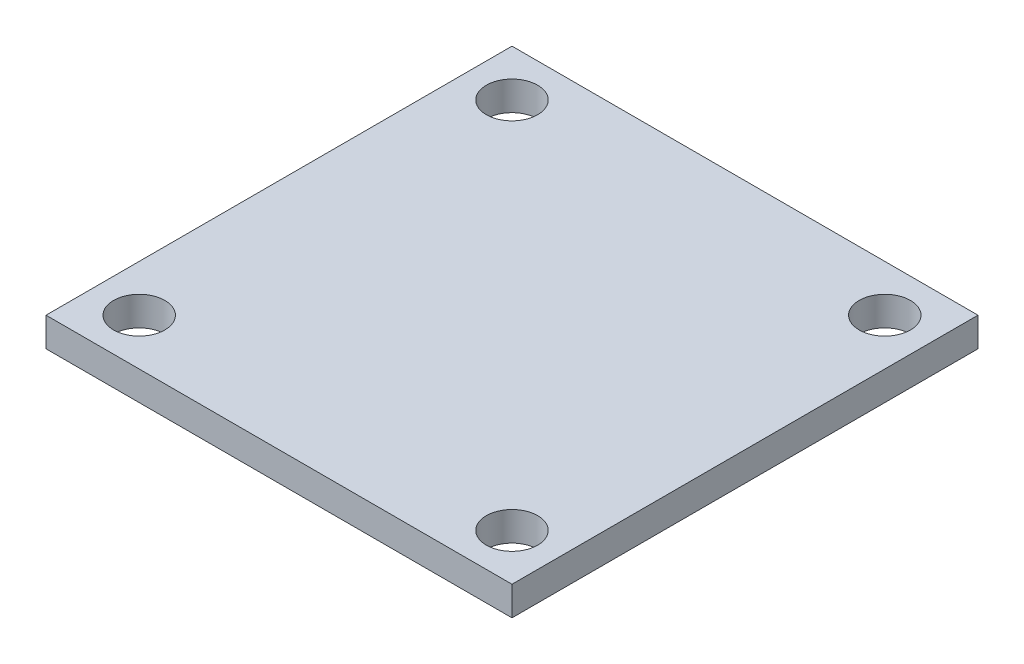
ISO-10303-21;
HEADER;
FILE_DESCRIPTION(('STEP AP214'),'2;1');
FILE_NAME('part.step','',(''),(''),'','','');
FILE_SCHEMA(('AUTOMOTIVE_DESIGN { 1 0 10303 214 1 1 1 1 }'));
ENDSEC;
DATA;
#1=APPLICATION_CONTEXT('core data for automotive mechanical design processes');
#2=APPLICATION_PROTOCOL_DEFINITION('international standard','automotive_design',2000,#1);
#3=PRODUCT_CONTEXT('',#1,'mechanical');
#4=PRODUCT('Part','Part','',(#3));
#5=PRODUCT_RELATED_PRODUCT_CATEGORY('part','',(#4));
#6=PRODUCT_DEFINITION_FORMATION('','',#4);
#7=PRODUCT_DEFINITION_CONTEXT('part definition',#1,'design');
#8=PRODUCT_DEFINITION('design','',#6,#7);
#9=PRODUCT_DEFINITION_SHAPE('','',#8);
#10=(LENGTH_UNIT() NAMED_UNIT(*) SI_UNIT(.MILLI.,.METRE.));
#11=(NAMED_UNIT(*) PLANE_ANGLE_UNIT() SI_UNIT($,.RADIAN.));
#12=(NAMED_UNIT(*) SI_UNIT($,.STERADIAN.) SOLID_ANGLE_UNIT());
#13=UNCERTAINTY_MEASURE_WITH_UNIT(LENGTH_MEASURE(1.E-05),#10,'distance_accuracy_value','');
#14=(GEOMETRIC_REPRESENTATION_CONTEXT(3) GLOBAL_UNCERTAINTY_ASSIGNED_CONTEXT((#13)) GLOBAL_UNIT_ASSIGNED_CONTEXT((#10,
#11,#12)) REPRESENTATION_CONTEXT('',''));
#15=CARTESIAN_POINT('',(0.,0.,0.));
#16=DIRECTION('',(0.,0.,1.));
#17=DIRECTION('',(1.,0.,0.));
#18=AXIS2_PLACEMENT_3D('',#15,#16,#17);
#19=CARTESIAN_POINT('',(80.0000000000001,0.,80.));
#20=DIRECTION('',(0.,1.,0.));
#21=DIRECTION('',(0.,0.,1.));
#22=AXIS2_PLACEMENT_3D('',#19,#20,#21);
#23=CYLINDRICAL_SURFACE('',#22,11.);
#24=CARTESIAN_POINT('',(80.0000000000001,0.,80.));
#25=DIRECTION('',(0.,1.,0.));
#26=DIRECTION('',(0.,0.,1.));
#27=AXIS2_PLACEMENT_3D('',#24,#25,#26);
#28=CIRCLE('',#27,11.);
#29=CARTESIAN_POINT('',(80.0000000000001,0.,91.));
#30=VERTEX_POINT('',#29);
#31=EDGE_CURVE('E41',#30,#30,#28,.T.);
#32=ORIENTED_EDGE('',*,*,#31,.F.);
#33=EDGE_LOOP('',(#32));
#34=FACE_BOUND('',#33,.T.);
#35=CARTESIAN_POINT('',(80.0000000000001,12.5,80.));
#36=DIRECTION('',(0.,1.,0.));
#37=DIRECTION('',(0.,0.,1.));
#38=AXIS2_PLACEMENT_3D('',#35,#36,#37);
#39=CIRCLE('',#38,11.);
#40=CARTESIAN_POINT('',(80.0000000000001,12.5,91.));
#41=VERTEX_POINT('',#40);
#42=EDGE_CURVE('E11',#41,#41,#39,.T.);
#43=ORIENTED_EDGE('',*,*,#42,.T.);
#44=EDGE_LOOP('',(#43));
#45=FACE_BOUND('',#44,.T.);
#46=ADVANCED_FACE('F33',(#34,#45),#23,.F.);
#47=CARTESIAN_POINT('',(-79.9999999999999,0.,80.));
#48=DIRECTION('',(0.,1.,0.));
#49=DIRECTION('',(0.,0.,1.));
#50=AXIS2_PLACEMENT_3D('',#47,#48,#49);
#51=CYLINDRICAL_SURFACE('',#50,11.);
#52=CARTESIAN_POINT('',(-79.9999999999999,0.,80.));
#53=DIRECTION('',(0.,1.,0.));
#54=DIRECTION('',(0.,0.,1.));
#55=AXIS2_PLACEMENT_3D('',#52,#53,#54);
#56=CIRCLE('',#55,11.);
#57=CARTESIAN_POINT('',(-79.9999999999999,0.,91.));
#58=VERTEX_POINT('',#57);
#59=EDGE_CURVE('E111',#58,#58,#56,.T.);
#60=ORIENTED_EDGE('',*,*,#59,.F.);
#61=EDGE_LOOP('',(#60));
#62=FACE_BOUND('',#61,.T.);
#63=CARTESIAN_POINT('',(-79.9999999999999,12.5,80.));
#64=DIRECTION('',(0.,1.,0.));
#65=DIRECTION('',(0.,0.,1.));
#66=AXIS2_PLACEMENT_3D('',#63,#64,#65);
#67=CIRCLE('',#66,11.);
#68=CARTESIAN_POINT('',(-79.9999999999999,12.5,91.));
#69=VERTEX_POINT('',#68);
#70=EDGE_CURVE('E114',#69,#69,#67,.T.);
#71=ORIENTED_EDGE('',*,*,#70,.T.);
#72=EDGE_LOOP('',(#71));
#73=FACE_BOUND('',#72,.T.);
#74=ADVANCED_FACE('F123',(#62,#73),#51,.F.);
#75=CARTESIAN_POINT('',(100.,12.5,-100.));
#76=DIRECTION('',(-1.,0.,0.));
#77=DIRECTION('',(0.,0.,1.));
#78=AXIS2_PLACEMENT_3D('',#75,#76,#77);
#79=PLANE('',#78);
#80=DIRECTION('',(0.,0.,-1.));
#81=VECTOR('',#80,1.);
#82=CARTESIAN_POINT('',(100.,0.,-100.));
#83=LINE('',#82,#81);
#84=CARTESIAN_POINT('',(100.,0.,100.));
#85=VERTEX_POINT('',#84);
#86=CARTESIAN_POINT('',(100.,0.,-100.));
#87=VERTEX_POINT('',#86);
#88=EDGE_CURVE('E101',#85,#87,#83,.T.);
#89=ORIENTED_EDGE('',*,*,#88,.T.);
#90=DIRECTION('',(0.,-1.,0.));
#91=VECTOR('',#90,1.);
#92=CARTESIAN_POINT('',(100.,12.5,-100.));
#93=LINE('',#92,#91);
#94=CARTESIAN_POINT('',(100.,12.5,-100.));
#95=VERTEX_POINT('',#94);
#96=EDGE_CURVE('E92',#95,#87,#93,.T.);
#97=ORIENTED_EDGE('',*,*,#96,.F.);
#98=DIRECTION('',(0.,0.,-1.));
#99=VECTOR('',#98,1.);
#100=CARTESIAN_POINT('',(100.,12.5,-100.));
#101=LINE('',#100,#99);
#102=CARTESIAN_POINT('',(100.,12.5,100.));
#103=VERTEX_POINT('',#102);
#104=EDGE_CURVE('E86',#103,#95,#101,.T.);
#105=ORIENTED_EDGE('',*,*,#104,.F.);
#106=DIRECTION('',(0.,-1.,0.));
#107=VECTOR('',#106,1.);
#108=CARTESIAN_POINT('',(100.,12.5,100.));
#109=LINE('',#108,#107);
#110=EDGE_CURVE('E97',#103,#85,#109,.T.);
#111=ORIENTED_EDGE('',*,*,#110,.T.);
#112=EDGE_LOOP('',(#89,#97,#105,#111));
#113=FACE_BOUND('',#112,.T.);
#114=ADVANCED_FACE('F147',(#113),#79,.F.);
#115=CARTESIAN_POINT('',(-99.9999999999999,12.5,-100.));
#116=DIRECTION('',(0.,0.,1.));
#117=DIRECTION('',(1.,0.,0.));
#118=AXIS2_PLACEMENT_3D('',#115,#116,#117);
#119=PLANE('',#118);
#120=DIRECTION('',(-1.,0.,0.));
#121=VECTOR('',#120,1.);
#122=CARTESIAN_POINT('',(-99.9999999999999,0.,-100.));
#123=LINE('',#122,#121);
#124=CARTESIAN_POINT('',(-99.9999999999999,0.,-100.));
#125=VERTEX_POINT('',#124);
#126=EDGE_CURVE('E91',#87,#125,#123,.T.);
#127=ORIENTED_EDGE('',*,*,#126,.T.);
#128=DIRECTION('',(0.,-1.,0.));
#129=VECTOR('',#128,1.);
#130=CARTESIAN_POINT('',(-99.9999999999999,12.5,-100.));
#131=LINE('',#130,#129);
#132=CARTESIAN_POINT('',(-99.9999999999999,12.5,-100.));
#133=VERTEX_POINT('',#132);
#134=EDGE_CURVE('E89',#133,#125,#131,.T.);
#135=ORIENTED_EDGE('',*,*,#134,.F.);
#136=DIRECTION('',(-1.,0.,0.));
#137=VECTOR('',#136,1.);
#138=CARTESIAN_POINT('',(-99.9999999999999,12.5,-100.));
#139=LINE('',#138,#137);
#140=EDGE_CURVE('E80',#95,#133,#139,.T.);
#141=ORIENTED_EDGE('',*,*,#140,.F.);
#142=ORIENTED_EDGE('',*,*,#96,.T.);
#143=EDGE_LOOP('',(#127,#135,#141,#142));
#144=FACE_BOUND('',#143,.T.);
#145=ADVANCED_FACE('F90',(#144),#119,.F.);
#146=CARTESIAN_POINT('',(-99.9999999999999,12.5,-100.));
#147=DIRECTION('',(1.,0.,0.));
#148=DIRECTION('',(0.,0.,-1.));
#149=AXIS2_PLACEMENT_3D('',#146,#147,#148);
#150=PLANE('',#149);
#151=DIRECTION('',(0.,0.,1.));
#152=VECTOR('',#151,1.);
#153=CARTESIAN_POINT('',(-99.9999999999999,0.,-100.));
#154=LINE('',#153,#152);
#155=CARTESIAN_POINT('',(-99.9999999999999,0.,100.));
#156=VERTEX_POINT('',#155);
#157=EDGE_CURVE('E66',#125,#156,#154,.T.);
#158=ORIENTED_EDGE('',*,*,#157,.T.);
#159=DIRECTION('',(0.,-1.,0.));
#160=VECTOR('',#159,1.);
#161=CARTESIAN_POINT('',(-99.9999999999999,12.5,100.));
#162=LINE('',#161,#160);
#163=CARTESIAN_POINT('',(-99.9999999999999,12.5,100.));
#164=VERTEX_POINT('',#163);
#165=EDGE_CURVE('E93',#164,#156,#162,.T.);
#166=ORIENTED_EDGE('',*,*,#165,.F.);
#167=DIRECTION('',(0.,0.,1.));
#168=VECTOR('',#167,1.);
#169=CARTESIAN_POINT('',(-99.9999999999999,12.5,-100.));
#170=LINE('',#169,#168);
#171=EDGE_CURVE('E84',#133,#164,#170,.T.);
#172=ORIENTED_EDGE('',*,*,#171,.F.);
#173=ORIENTED_EDGE('',*,*,#134,.T.);
#174=EDGE_LOOP('',(#158,#166,#172,#173));
#175=FACE_BOUND('',#174,.T.);
#176=ADVANCED_FACE('F95',(#175),#150,.F.);
#177=CARTESIAN_POINT('',(-99.9999999999999,12.5,100.));
#178=DIRECTION('',(0.,0.,-1.));
#179=DIRECTION('',(-1.,0.,0.));
#180=AXIS2_PLACEMENT_3D('',#177,#178,#179);
#181=PLANE('',#180);
#182=DIRECTION('',(1.,0.,0.));
#183=VECTOR('',#182,1.);
#184=CARTESIAN_POINT('',(-99.9999999999999,0.,100.));
#185=LINE('',#184,#183);
#186=EDGE_CURVE('E72',#156,#85,#185,.T.);
#187=ORIENTED_EDGE('',*,*,#186,.T.);
#188=ORIENTED_EDGE('',*,*,#110,.F.);
#189=DIRECTION('',(1.,0.,0.));
#190=VECTOR('',#189,1.);
#191=CARTESIAN_POINT('',(-99.9999999999999,12.5,100.));
#192=LINE('',#191,#190);
#193=EDGE_CURVE('E49',#164,#103,#192,.T.);
#194=ORIENTED_EDGE('',*,*,#193,.F.);
#195=ORIENTED_EDGE('',*,*,#165,.T.);
#196=EDGE_LOOP('',(#187,#188,#194,#195));
#197=FACE_BOUND('',#196,.T.);
#198=ADVANCED_FACE('F127',(#197),#181,.F.);
#199=CARTESIAN_POINT('',(0.,12.5,0.));
#200=DIRECTION('',(0.,1.,0.));
#201=DIRECTION('',(0.,0.,1.));
#202=AXIS2_PLACEMENT_3D('',#199,#200,#201);
#203=PLANE('',#202);
#204=CARTESIAN_POINT('',(80.0000000000001,12.5,-80.));
#205=DIRECTION('',(0.,1.,0.));
#206=DIRECTION('',(0.,0.,1.));
#207=AXIS2_PLACEMENT_3D('',#204,#205,#206);
#208=CIRCLE('',#207,11.);
#209=CARTESIAN_POINT('',(80.0000000000001,12.5,-69.));
#210=VERTEX_POINT('',#209);
#211=EDGE_CURVE('E218',#210,#210,#208,.T.);
#212=ORIENTED_EDGE('',*,*,#211,.F.);
#213=EDGE_LOOP('',(#212));
#214=FACE_BOUND('',#213,.T.);
#215=CARTESIAN_POINT('',(-79.9999999999999,12.5,-80.));
#216=DIRECTION('',(0.,1.,0.));
#217=DIRECTION('',(0.,0.,1.));
#218=AXIS2_PLACEMENT_3D('',#215,#216,#217);
#219=CIRCLE('',#218,11.);
#220=CARTESIAN_POINT('',(-79.9999999999999,12.5,-69.));
#221=VERTEX_POINT('',#220);
#222=EDGE_CURVE('E219',#221,#221,#219,.T.);
#223=ORIENTED_EDGE('',*,*,#222,.F.);
#224=EDGE_LOOP('',(#223));
#225=FACE_BOUND('',#224,.T.);
#226=ORIENTED_EDGE('',*,*,#104,.T.);
#227=ORIENTED_EDGE('',*,*,#140,.T.);
#228=ORIENTED_EDGE('',*,*,#171,.T.);
#229=ORIENTED_EDGE('',*,*,#193,.T.);
#230=EDGE_LOOP('',(#226,#227,#228,#229));
#231=FACE_BOUND('',#230,.T.);
#232=ORIENTED_EDGE('',*,*,#70,.F.);
#233=EDGE_LOOP('',(#232));
#234=FACE_BOUND('',#233,.T.);
#235=ORIENTED_EDGE('',*,*,#42,.F.);
#236=EDGE_LOOP('',(#235));
#237=FACE_BOUND('',#236,.T.);
#238=ADVANCED_FACE('F81',(#214,#225,#231,#234,#237),#203,.T.);
#239=CARTESIAN_POINT('',(0.,0.,0.));
#240=DIRECTION('',(0.,1.,0.));
#241=DIRECTION('',(0.,0.,1.));
#242=AXIS2_PLACEMENT_3D('',#239,#240,#241);
#243=PLANE('',#242);
#244=CARTESIAN_POINT('',(80.0000000000001,0.,-80.));
#245=DIRECTION('',(0.,1.,0.));
#246=DIRECTION('',(0.,0.,1.));
#247=AXIS2_PLACEMENT_3D('',#244,#245,#246);
#248=CIRCLE('',#247,11.);
#249=CARTESIAN_POINT('',(80.0000000000001,0.,-69.));
#250=VERTEX_POINT('',#249);
#251=EDGE_CURVE('E216',#250,#250,#248,.T.);
#252=ORIENTED_EDGE('',*,*,#251,.T.);
#253=EDGE_LOOP('',(#252));
#254=FACE_BOUND('',#253,.T.);
#255=CARTESIAN_POINT('',(-79.9999999999999,0.,-80.));
#256=DIRECTION('',(0.,1.,0.));
#257=DIRECTION('',(0.,0.,1.));
#258=AXIS2_PLACEMENT_3D('',#255,#256,#257);
#259=CIRCLE('',#258,11.);
#260=CARTESIAN_POINT('',(-79.9999999999999,0.,-69.));
#261=VERTEX_POINT('',#260);
#262=EDGE_CURVE('E104',#261,#261,#259,.T.);
#263=ORIENTED_EDGE('',*,*,#262,.T.);
#264=EDGE_LOOP('',(#263));
#265=FACE_BOUND('',#264,.T.);
#266=ORIENTED_EDGE('',*,*,#88,.F.);
#267=ORIENTED_EDGE('',*,*,#186,.F.);
#268=ORIENTED_EDGE('',*,*,#157,.F.);
#269=ORIENTED_EDGE('',*,*,#126,.F.);
#270=EDGE_LOOP('',(#266,#267,#268,#269));
#271=FACE_BOUND('',#270,.T.);
#272=ORIENTED_EDGE('',*,*,#59,.T.);
#273=EDGE_LOOP('',(#272));
#274=FACE_BOUND('',#273,.T.);
#275=ORIENTED_EDGE('',*,*,#31,.T.);
#276=EDGE_LOOP('',(#275));
#277=FACE_BOUND('',#276,.T.);
#278=ADVANCED_FACE('F119',(#254,#265,#271,#274,#277),#243,.F.);
#279=CARTESIAN_POINT('',(-79.9999999999999,0.,-80.));
#280=DIRECTION('',(0.,1.,0.));
#281=DIRECTION('',(0.,0.,1.));
#282=AXIS2_PLACEMENT_3D('',#279,#280,#281);
#283=CYLINDRICAL_SURFACE('',#282,11.);
#284=ORIENTED_EDGE('',*,*,#262,.F.);
#285=EDGE_LOOP('',(#284));
#286=FACE_BOUND('',#285,.T.);
#287=ORIENTED_EDGE('',*,*,#222,.T.);
#288=EDGE_LOOP('',(#287));
#289=FACE_BOUND('',#288,.T.);
#290=ADVANCED_FACE('F134',(#286,#289),#283,.F.);
#291=CARTESIAN_POINT('',(80.0000000000001,0.,-80.));
#292=DIRECTION('',(0.,1.,0.));
#293=DIRECTION('',(0.,0.,1.));
#294=AXIS2_PLACEMENT_3D('',#291,#292,#293);
#295=CYLINDRICAL_SURFACE('',#294,11.);
#296=ORIENTED_EDGE('',*,*,#251,.F.);
#297=EDGE_LOOP('',(#296));
#298=FACE_BOUND('',#297,.T.);
#299=ORIENTED_EDGE('',*,*,#211,.T.);
#300=EDGE_LOOP('',(#299));
#301=FACE_BOUND('',#300,.T.);
#302=ADVANCED_FACE('F185',(#298,#301),#295,.F.);
#303=CLOSED_SHELL('',(#46,#74,#114,#145,#176,#198,#238,#278,#290,#302));
#304=MANIFOLD_SOLID_BREP('B2',#303);
#305=ADVANCED_BREP_SHAPE_REPRESENTATION('',(#18,#304),#14);
#306=SHAPE_DEFINITION_REPRESENTATION(#9,#305);
ENDSEC;
END-ISO-10303-21;
